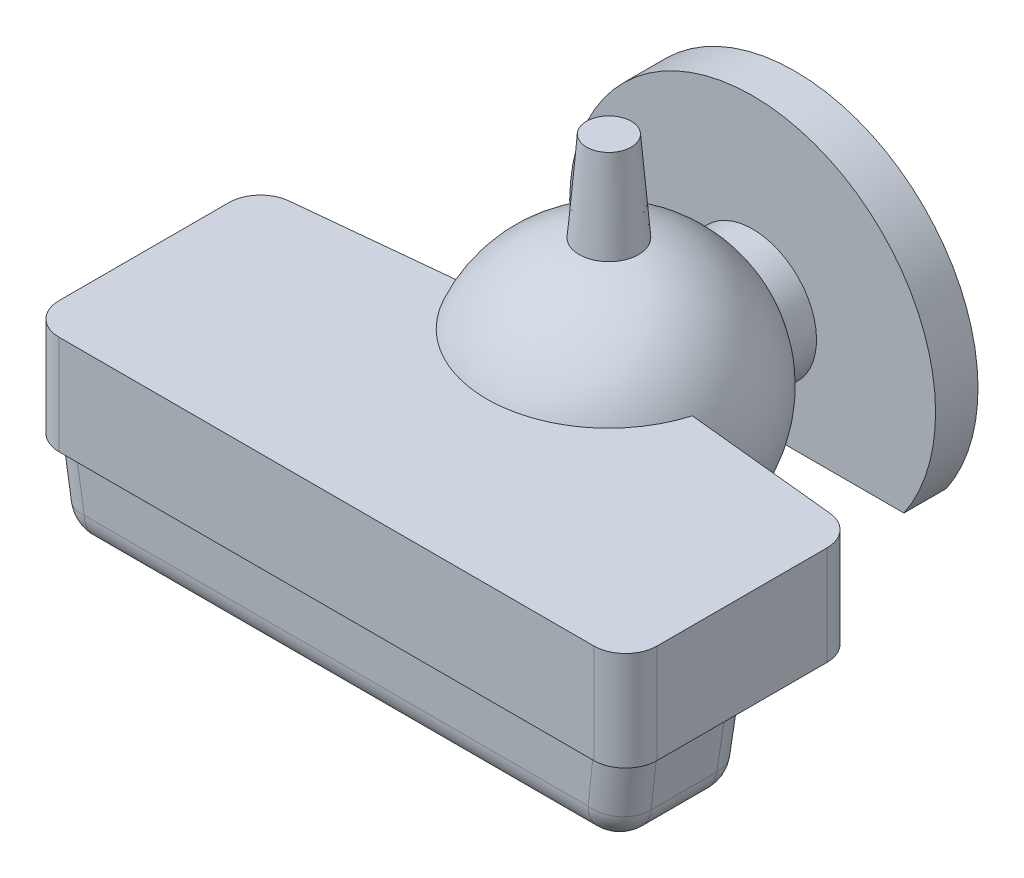
ISO-10303-21;
HEADER;
FILE_DESCRIPTION(('STEP AP214'),'2;1');
FILE_NAME('part.step','',(''),(''),'','','');
FILE_SCHEMA(('AUTOMOTIVE_DESIGN { 1 0 10303 214 1 1 1 1 }'));
ENDSEC;
DATA;
#1=APPLICATION_CONTEXT('core data for automotive mechanical design processes');
#2=APPLICATION_PROTOCOL_DEFINITION('international standard','automotive_design',2000,#1);
#3=PRODUCT_CONTEXT('',#1,'mechanical');
#4=PRODUCT('Part','Part','',(#3));
#5=PRODUCT_RELATED_PRODUCT_CATEGORY('part','',(#4));
#6=PRODUCT_DEFINITION_FORMATION('','',#4);
#7=PRODUCT_DEFINITION_CONTEXT('part definition',#1,'design');
#8=PRODUCT_DEFINITION('design','',#6,#7);
#9=PRODUCT_DEFINITION_SHAPE('','',#8);
#10=(LENGTH_UNIT() NAMED_UNIT(*) SI_UNIT(.MILLI.,.METRE.));
#11=(NAMED_UNIT(*) PLANE_ANGLE_UNIT() SI_UNIT($,.RADIAN.));
#12=(NAMED_UNIT(*) SI_UNIT($,.STERADIAN.) SOLID_ANGLE_UNIT());
#13=UNCERTAINTY_MEASURE_WITH_UNIT(LENGTH_MEASURE(1.E-05),#10,'distance_accuracy_value','');
#14=(GEOMETRIC_REPRESENTATION_CONTEXT(3) GLOBAL_UNCERTAINTY_ASSIGNED_CONTEXT((#13)) GLOBAL_UNIT_ASSIGNED_CONTEXT((#10,
#11,#12)) REPRESENTATION_CONTEXT('',''));
#15=CARTESIAN_POINT('',(0.,0.,0.));
#16=DIRECTION('',(0.,0.,1.));
#17=DIRECTION('',(1.,0.,0.));
#18=AXIS2_PLACEMENT_3D('',#15,#16,#17);
#19=CARTESIAN_POINT('',(15.5718563757614,46.1,26.46));
#20=DIRECTION('',(0.,-1.,0.));
#21=DIRECTION('',(0.,0.,-1.));
#22=AXIS2_PLACEMENT_3D('',#19,#20,#21);
#23=CONICAL_SURFACE('',#22,3.18,0.081260061509888);
#24=CARTESIAN_POINT('',(15.5718563757614,46.1,26.46));
#25=DIRECTION('',(0.,-1.,0.));
#26=DIRECTION('',(0.,0.,-1.));
#27=AXIS2_PLACEMENT_3D('',#24,#25,#26);
#28=CIRCLE('',#27,3.18);
#29=CARTESIAN_POINT('',(15.5718563757614,46.1,23.28));
#30=VERTEX_POINT('',#29);
#31=EDGE_CURVE('E11',#30,#30,#28,.T.);
#32=ORIENTED_EDGE('',*,*,#31,.T.);
#33=EDGE_LOOP('',(#32));
#34=FACE_BOUND('',#33,.T.);
#35=CARTESIAN_POINT('',(15.5718563757614,33.3793441016559,26.46));
#36=DIRECTION('',(0.,-1.,0.));
#37=DIRECTION('',(0.,0.,-1.));
#38=AXIS2_PLACEMENT_3D('',#35,#36,#37);
#39=CIRCLE('',#38,4.21596250687272);
#40=CARTESIAN_POINT('',(15.5718563757614,33.3793441016559,22.2440374931273));
#41=VERTEX_POINT('',#40);
#42=EDGE_CURVE('E204',#41,#41,#39,.T.);
#43=ORIENTED_EDGE('',*,*,#42,.F.);
#44=EDGE_LOOP('',(#43));
#45=FACE_BOUND('',#44,.T.);
#46=ADVANCED_FACE('F17',(#34,#45),#23,.T.);
#47=CARTESIAN_POINT('',(15.5718563757614,46.1,26.46));
#48=DIRECTION('',(0.,-1.,0.));
#49=DIRECTION('',(0.,0.,-1.));
#50=AXIS2_PLACEMENT_3D('',#47,#48,#49);
#51=PLANE('',#50);
#52=ORIENTED_EDGE('',*,*,#31,.F.);
#53=EDGE_LOOP('',(#52));
#54=FACE_BOUND('',#53,.T.);
#55=ADVANCED_FACE('F379',(#54),#51,.F.);
#56=CARTESIAN_POINT('',(-20.230588996658,0.780000000000002,51.375));
#57=DIRECTION('',(0.,0.,1.));
#58=DIRECTION('',(1.,0.,0.));
#59=AXIS2_PLACEMENT_3D('',#56,#57,#58);
#60=CYLINDRICAL_SURFACE('',#59,4.5);
#61=CARTESIAN_POINT('',(-20.230588996658,0.780000000000002,51.3870473088788));
#62=DIRECTION('',(0.,0.,1.));
#63=DIRECTION('',(1.,0.,0.));
#64=AXIS2_PLACEMENT_3D('',#61,#62,#63);
#65=CIRCLE('',#64,4.49999999999999);
#66=CARTESIAN_POINT('',(-24.692261915057,0.193932794617084,51.3870473088788));
#67=VERTEX_POINT('',#66);
#68=CARTESIAN_POINT('',(-20.230588996658,-3.72,51.3870473088788));
#69=VERTEX_POINT('',#68);
#70=EDGE_CURVE('E27',#67,#69,#65,.T.);
#71=ORIENTED_EDGE('',*,*,#70,.T.);
#72=DIRECTION('',(0.,0.,1.));
#73=VECTOR('',#72,1.);
#74=CARTESIAN_POINT('',(-20.230588996658,-3.72,51.375));
#75=LINE('',#74,#73);
#76=CARTESIAN_POINT('',(-20.230588996658,-3.72,60.7129526911211));
#77=VERTEX_POINT('',#76);
#78=EDGE_CURVE('E367',#69,#77,#75,.T.);
#79=ORIENTED_EDGE('',*,*,#78,.T.);
#80=CARTESIAN_POINT('',(-20.230588996658,0.780000000000002,60.7129526911211));
#81=DIRECTION('',(0.,0.,-1.));
#82=DIRECTION('',(0.,-1.,0.));
#83=AXIS2_PLACEMENT_3D('',#80,#81,#82);
#84=CIRCLE('',#83,4.5);
#85=CARTESIAN_POINT('',(-24.692261915057,0.193932794617085,60.7129526911211));
#86=VERTEX_POINT('',#85);
#87=EDGE_CURVE('E364',#77,#86,#84,.T.);
#88=ORIENTED_EDGE('',*,*,#87,.T.);
#89=DIRECTION('',(0.,0.,-1.));
#90=VECTOR('',#89,1.);
#91=CARTESIAN_POINT('',(-24.692261915057,0.193932794617085,51.375));
#92=LINE('',#91,#90);
#93=EDGE_CURVE('E361',#86,#67,#92,.T.);
#94=ORIENTED_EDGE('',*,*,#93,.T.);
#95=EDGE_LOOP('',(#71,#79,#88,#94));
#96=FACE_BOUND('',#95,.T.);
#97=ADVANCED_FACE('F386',(#96),#60,.T.);
#98=CARTESIAN_POINT('',(-5.07814362423863,0.780000000000003,60.7129526911211));
#99=DIRECTION('',(1.,0.,0.));
#100=DIRECTION('',(0.,1.,0.));
#101=AXIS2_PLACEMENT_3D('',#98,#99,#100);
#102=CYLINDRICAL_SURFACE('',#101,4.5);
#103=CARTESIAN_POINT('',(-20.230588996658,0.780000000000003,60.7129526911211));
#104=DIRECTION('',(1.,0.,0.));
#105=DIRECTION('',(0.,1.,0.));
#106=AXIS2_PLACEMENT_3D('',#103,#104,#105);
#107=CIRCLE('',#106,4.5);
#108=CARTESIAN_POINT('',(-20.230588996658,0.66563017674994,65.2114990722903));
#109=VERTEX_POINT('',#108);
#110=EDGE_CURVE('E359',#109,#77,#107,.T.);
#111=ORIENTED_EDGE('',*,*,#110,.T.);
#112=DIRECTION('',(1.,0.,0.));
#113=VECTOR('',#112,1.);
#114=CARTESIAN_POINT('',(-5.07814362423863,-3.72,60.7129526911211));
#115=LINE('',#114,#113);
#116=CARTESIAN_POINT('',(51.3743017481808,-3.72,60.7129526911211));
#117=VERTEX_POINT('',#116);
#118=EDGE_CURVE('E356',#77,#117,#115,.T.);
#119=ORIENTED_EDGE('',*,*,#118,.T.);
#120=CARTESIAN_POINT('',(51.3743017481808,0.780000000000003,60.7129526911211));
#121=DIRECTION('',(-1.,0.,0.));
#122=DIRECTION('',(0.,0.,1.));
#123=AXIS2_PLACEMENT_3D('',#120,#121,#122);
#124=CIRCLE('',#123,4.5);
#125=CARTESIAN_POINT('',(51.3743017481808,0.66563017674994,65.2114990722903));
#126=VERTEX_POINT('',#125);
#127=EDGE_CURVE('E353',#117,#126,#124,.T.);
#128=ORIENTED_EDGE('',*,*,#127,.T.);
#129=DIRECTION('',(-1.,0.,0.));
#130=VECTOR('',#129,1.);
#131=CARTESIAN_POINT('',(-5.07814362423863,0.66563017674994,65.2114990722903));
#132=LINE('',#131,#130);
#133=EDGE_CURVE('E350',#126,#109,#132,.T.);
#134=ORIENTED_EDGE('',*,*,#133,.T.);
#135=EDGE_LOOP('',(#111,#119,#128,#134));
#136=FACE_BOUND('',#135,.T.);
#137=ADVANCED_FACE('F400',(#136),#102,.T.);
#138=CARTESIAN_POINT('',(-20.230588996658,0.780000000000002,60.7129526911211));
#139=DIRECTION('',(0.,0.,1.));
#140=DIRECTION('',(1.,0.,0.));
#141=AXIS2_PLACEMENT_3D('',#138,#139,#140);
#142=SPHERICAL_SURFACE('',#141,4.5);
#143=ORIENTED_EDGE('',*,*,#110,.F.);
#144=CARTESIAN_POINT('',(-20.230588996658,0.780000000000004,60.7129526911211));
#145=DIRECTION('',(0.13019579995124,-0.991168025435241,-0.0251991870873368));
#146=DIRECTION('',(0.,0.0254155162777918,-0.999676973593137));
#147=AXIS2_PLACEMENT_3D('',#144,#145,#146);
#148=CIRCLE('',#147,4.5);
#149=EDGE_CURVE('E348',#109,#86,#148,.T.);
#150=ORIENTED_EDGE('',*,*,#149,.T.);
#151=ORIENTED_EDGE('',*,*,#87,.F.);
#152=EDGE_LOOP('',(#143,#150,#151));
#153=FACE_BOUND('',#152,.T.);
#154=ADVANCED_FACE('F404',(#153),#142,.T.);
#155=CARTESIAN_POINT('',(51.3743017481808,0.780000000000003,60.725));
#156=DIRECTION('',(0.,0.,-1.));
#157=DIRECTION('',(-1.,0.,0.));
#158=AXIS2_PLACEMENT_3D('',#155,#156,#157);
#159=CYLINDRICAL_SURFACE('',#158,4.5);
#160=CARTESIAN_POINT('',(51.3743017481808,0.780000000000003,60.7129526911211));
#161=DIRECTION('',(0.,0.,-1.));
#162=DIRECTION('',(0.,-1.,0.));
#163=AXIS2_PLACEMENT_3D('',#160,#161,#162);
#164=CIRCLE('',#163,4.5);
#165=CARTESIAN_POINT('',(55.8359746665797,0.193932794617094,60.7129526911211));
#166=VERTEX_POINT('',#165);
#167=EDGE_CURVE('E346',#166,#117,#164,.T.);
#168=ORIENTED_EDGE('',*,*,#167,.T.);
#169=DIRECTION('',(0.,0.,-1.));
#170=VECTOR('',#169,1.);
#171=CARTESIAN_POINT('',(51.3743017481808,-3.72,60.725));
#172=LINE('',#171,#170);
#173=CARTESIAN_POINT('',(51.3743017481808,-3.72,51.3870473088789));
#174=VERTEX_POINT('',#173);
#175=EDGE_CURVE('E343',#117,#174,#172,.T.);
#176=ORIENTED_EDGE('',*,*,#175,.T.);
#177=CARTESIAN_POINT('',(51.3743017481808,0.780000000000003,51.3870473088789));
#178=DIRECTION('',(0.,0.,1.));
#179=DIRECTION('',(1.,0.,0.));
#180=AXIS2_PLACEMENT_3D('',#177,#178,#179);
#181=CIRCLE('',#180,4.5);
#182=CARTESIAN_POINT('',(55.8359746665797,0.193932794617094,51.3870473088789));
#183=VERTEX_POINT('',#182);
#184=EDGE_CURVE('E340',#174,#183,#181,.T.);
#185=ORIENTED_EDGE('',*,*,#184,.T.);
#186=DIRECTION('',(0.,0.,1.));
#187=VECTOR('',#186,1.);
#188=CARTESIAN_POINT('',(55.8359746665797,0.193932794617094,60.725));
#189=LINE('',#188,#187);
#190=EDGE_CURVE('E337',#183,#166,#189,.T.);
#191=ORIENTED_EDGE('',*,*,#190,.T.);
#192=EDGE_LOOP('',(#168,#176,#185,#191));
#193=FACE_BOUND('',#192,.T.);
#194=ADVANCED_FACE('F406',(#193),#159,.T.);
#195=CARTESIAN_POINT('',(51.3743017481808,0.780000000000003,60.7129526911211));
#196=DIRECTION('',(0.,0.,1.));
#197=DIRECTION('',(1.,0.,0.));
#198=AXIS2_PLACEMENT_3D('',#195,#196,#197);
#199=SPHERICAL_SURFACE('',#198,4.5);
#200=ORIENTED_EDGE('',*,*,#167,.F.);
#201=CARTESIAN_POINT('',(51.3743017481808,0.780000000000003,60.7129526911211));
#202=DIRECTION('',(-0.130195799951238,-0.991168025435241,-0.0251991870873369));
#203=DIRECTION('',(-0.991482870755324,0.130237156751757,0.));
#204=AXIS2_PLACEMENT_3D('',#201,#202,#203);
#205=CIRCLE('',#204,4.5);
#206=EDGE_CURVE('E335',#166,#126,#205,.T.);
#207=ORIENTED_EDGE('',*,*,#206,.T.);
#208=ORIENTED_EDGE('',*,*,#127,.F.);
#209=EDGE_LOOP('',(#200,#207,#208));
#210=FACE_BOUND('',#209,.T.);
#211=ADVANCED_FACE('F397',(#210),#199,.T.);
#212=CARTESIAN_POINT('',(36.2218563757614,0.780000000000003,51.3870473088788));
#213=DIRECTION('',(-1.,0.,0.));
#214=DIRECTION('',(0.,0.,1.));
#215=AXIS2_PLACEMENT_3D('',#212,#213,#214);
#216=CYLINDRICAL_SURFACE('',#215,4.5);
#217=CARTESIAN_POINT('',(51.3743017481808,0.780000000000003,51.3870473088788));
#218=DIRECTION('',(-1.,0.,0.));
#219=DIRECTION('',(0.,0.,1.));
#220=AXIS2_PLACEMENT_3D('',#217,#218,#219);
#221=CIRCLE('',#220,4.49999999999999);
#222=CARTESIAN_POINT('',(51.3743017481808,0.665630176749943,46.8885009277097));
#223=VERTEX_POINT('',#222);
#224=EDGE_CURVE('E333',#223,#174,#221,.T.);
#225=ORIENTED_EDGE('',*,*,#224,.T.);
#226=DIRECTION('',(-1.,0.,0.));
#227=VECTOR('',#226,1.);
#228=CARTESIAN_POINT('',(36.2218563757614,-3.72,51.3870473088788));
#229=LINE('',#228,#227);
#230=EDGE_CURVE('E36',#174,#69,#229,.T.);
#231=ORIENTED_EDGE('',*,*,#230,.T.);
#232=CARTESIAN_POINT('',(-20.230588996658,0.780000000000003,51.3870473088788));
#233=DIRECTION('',(1.,0.,0.));
#234=DIRECTION('',(0.,0.,1.));
#235=AXIS2_PLACEMENT_3D('',#232,#233,#234);
#236=CIRCLE('',#235,4.5);
#237=CARTESIAN_POINT('',(-20.230588996658,0.665630176749943,46.8885009277097));
#238=VERTEX_POINT('',#237);
#239=EDGE_CURVE('E330',#69,#238,#236,.T.);
#240=ORIENTED_EDGE('',*,*,#239,.T.);
#241=DIRECTION('',(1.,0.,0.));
#242=VECTOR('',#241,1.);
#243=CARTESIAN_POINT('',(36.2218563757614,0.665630176749943,46.8885009277097));
#244=LINE('',#243,#242);
#245=EDGE_CURVE('E327',#238,#223,#244,.T.);
#246=ORIENTED_EDGE('',*,*,#245,.T.);
#247=EDGE_LOOP('',(#225,#231,#240,#246));
#248=FACE_BOUND('',#247,.T.);
#249=ADVANCED_FACE('F393',(#248),#216,.T.);
#250=CARTESIAN_POINT('',(51.3743017481808,0.780000000000003,51.3870473088789));
#251=DIRECTION('',(0.,0.,1.));
#252=DIRECTION('',(1.,0.,0.));
#253=AXIS2_PLACEMENT_3D('',#250,#251,#252);
#254=SPHERICAL_SURFACE('',#253,4.5);
#255=ORIENTED_EDGE('',*,*,#224,.F.);
#256=CARTESIAN_POINT('',(51.3743017481808,0.780000000000002,51.3870473088789));
#257=DIRECTION('',(-0.130195799951238,-0.991168025435241,0.0251991870873361));
#258=DIRECTION('',(-0.991482870755324,0.130237156751757,0.));
#259=AXIS2_PLACEMENT_3D('',#256,#257,#258);
#260=CIRCLE('',#259,4.50000000000001);
#261=EDGE_CURVE('E325',#223,#183,#260,.T.);
#262=ORIENTED_EDGE('',*,*,#261,.T.);
#263=ORIENTED_EDGE('',*,*,#184,.F.);
#264=EDGE_LOOP('',(#255,#262,#263));
#265=FACE_BOUND('',#264,.T.);
#266=ADVANCED_FACE('F396',(#265),#254,.T.);
#267=CARTESIAN_POINT('',(-20.230588996658,0.780000000000003,51.3870473088788));
#268=DIRECTION('',(0.,0.,1.));
#269=DIRECTION('',(1.,0.,0.));
#270=AXIS2_PLACEMENT_3D('',#267,#268,#269);
#271=SPHERICAL_SURFACE('',#270,4.5);
#272=ORIENTED_EDGE('',*,*,#70,.F.);
#273=CARTESIAN_POINT('',(-20.230588996658,0.780000000000003,51.3870473088788));
#274=DIRECTION('',(0.13019579995124,-0.991168025435241,0.0251991870873362));
#275=DIRECTION('',(0.,-0.0254155162777911,-0.999676973593137));
#276=AXIS2_PLACEMENT_3D('',#273,#274,#275);
#277=CIRCLE('',#276,4.5);
#278=EDGE_CURVE('E323',#67,#238,#277,.T.);
#279=ORIENTED_EDGE('',*,*,#278,.T.);
#280=ORIENTED_EDGE('',*,*,#239,.F.);
#281=EDGE_LOOP('',(#272,#279,#280));
#282=FACE_BOUND('',#281,.T.);
#283=ADVANCED_FACE('F414',(#282),#271,.T.);
#284=CARTESIAN_POINT('',(51.7248289878145,3.44852995334088,60.7807966729857));
#285=DIRECTION('',(-0.130195799951238,-0.991168025435241,-0.0251991870873369));
#286=DIRECTION('',(-0.991482870755324,0.130237156751757,0.));
#287=AXIS2_PLACEMENT_3D('',#284,#285,#286);
#288=CYLINDRICAL_SURFACE('',#287,4.5);
#289=ORIENTED_EDGE('',*,*,#206,.F.);
#290=DIRECTION('',(0.130195799951238,0.991168025435241,0.0251991870873369));
#291=VECTOR('',#290,1.);
#292=CARTESIAN_POINT('',(56.1865019062135,2.86246274795797,60.7807966729857));
#293=LINE('',#292,#291);
#294=CARTESIAN_POINT('',(56.8718563757614,8.08,60.9134459251563));
#295=VERTEX_POINT('',#294);
#296=EDGE_CURVE('E320',#166,#295,#293,.T.);
#297=ORIENTED_EDGE('',*,*,#296,.T.);
#298=CARTESIAN_POINT('',(52.3332000532655,8.08,60.8985459114601));
#299=DIRECTION('',(0.,-1.,0.));
#300=DIRECTION('',(0.981779850590282,0.,0.190021906565858));
#301=AXIS2_PLACEMENT_3D('',#298,#299,#300);
#302=ELLIPSE('',#301,4.54009803032535,4.5);
#303=CARTESIAN_POINT('',(52.3482232080145,8.08,65.4));
#304=VERTEX_POINT('',#303);
#305=EDGE_CURVE('E317',#295,#304,#302,.T.);
#306=ORIENTED_EDGE('',*,*,#305,.T.);
#307=DIRECTION('',(-0.130195799951238,-0.991168025435241,-0.0251991870873369));
#308=VECTOR('',#307,1.);
#309=CARTESIAN_POINT('',(51.7248289878145,3.33416013009082,65.2793430541549));
#310=LINE('',#309,#308);
#311=EDGE_CURVE('E311',#304,#126,#310,.T.);
#312=ORIENTED_EDGE('',*,*,#311,.T.);
#313=EDGE_LOOP('',(#289,#297,#306,#312));
#314=FACE_BOUND('',#313,.T.);
#315=ADVANCED_FACE('F410',(#314),#288,.T.);
#316=CARTESIAN_POINT('',(56.8718563757614,8.08,65.4));
#317=DIRECTION('',(-0.991482870755324,0.130237156751757,0.));
#318=DIRECTION('',(-0.130237156751757,-0.991482870755324,0.));
#319=AXIS2_PLACEMENT_3D('',#316,#317,#318);
#320=PLANE('',#319);
#321=ORIENTED_EDGE('',*,*,#190,.F.);
#322=DIRECTION('',(-0.130195799951238,-0.991168025435241,0.0251991870873361));
#323=VECTOR('',#322,1.);
#324=CARTESIAN_POINT('',(56.8559002446327,7.95852751785897,51.189642358288));
#325=LINE('',#324,#323);
#326=CARTESIAN_POINT('',(56.8718563757614,8.08,51.1865540748437));
#327=VERTEX_POINT('',#326);
#328=EDGE_CURVE('E301',#327,#183,#325,.T.);
#329=ORIENTED_EDGE('',*,*,#328,.F.);
#330=DIRECTION('',(0.,0.,-1.));
#331=VECTOR('',#330,1.);
#332=CARTESIAN_POINT('',(56.8718563757614,8.08,57.4360883722715));
#333=LINE('',#332,#331);
#334=EDGE_CURVE('E294',#295,#327,#333,.T.);
#335=ORIENTED_EDGE('',*,*,#334,.F.);
#336=ORIENTED_EDGE('',*,*,#296,.F.);
#337=EDGE_LOOP('',(#321,#329,#335,#336));
#338=FACE_BOUND('',#337,.T.);
#339=ADVANCED_FACE('F413',(#338),#320,.F.);
#340=CARTESIAN_POINT('',(52.3942273262337,8.54459472324188,51.189642358288));
#341=DIRECTION('',(-0.130195799951238,-0.991168025435241,0.0251991870873361));
#342=DIRECTION('',(-0.991482870755324,0.130237156751757,0.));
#343=AXIS2_PLACEMENT_3D('',#340,#341,#342);
#344=CYLINDRICAL_SURFACE('',#343,4.5);
#345=ORIENTED_EDGE('',*,*,#261,.F.);
#346=DIRECTION('',(0.130195799951238,0.991168025435241,-0.0251991870873361));
#347=VECTOR('',#346,1.);
#348=CARTESIAN_POINT('',(52.3942273262337,8.43022489999182,46.6910959771189));
#349=LINE('',#348,#347);
#350=CARTESIAN_POINT('',(52.3482232080145,8.08,46.7));
#351=VERTEX_POINT('',#350);
#352=EDGE_CURVE('E308',#223,#351,#349,.T.);
#353=ORIENTED_EDGE('',*,*,#352,.T.);
#354=CARTESIAN_POINT('',(52.3332000532655,8.08,51.2014540885399));
#355=DIRECTION('',(0.,-1.,0.));
#356=DIRECTION('',(0.981779850590281,0.,-0.190021906565864));
#357=AXIS2_PLACEMENT_3D('',#354,#355,#356);
#358=ELLIPSE('',#357,4.54009803032535,4.5);
#359=EDGE_CURVE('E305',#351,#327,#358,.T.);
#360=ORIENTED_EDGE('',*,*,#359,.T.);
#361=ORIENTED_EDGE('',*,*,#328,.T.);
#362=EDGE_LOOP('',(#345,#353,#360,#361));
#363=FACE_BOUND('',#362,.T.);
#364=ADVANCED_FACE('F416',(#363),#344,.T.);
#365=CARTESIAN_POINT('',(56.8718563757614,8.08,46.7));
#366=DIRECTION('',(0.,0.0254155162777911,0.999676973593137));
#367=DIRECTION('',(0.,-0.999676973593137,0.0254155162777911));
#368=AXIS2_PLACEMENT_3D('',#365,#366,#367);
#369=PLANE('',#368);
#370=ORIENTED_EDGE('',*,*,#245,.F.);
#371=DIRECTION('',(0.13019579995124,-0.991168025435241,0.0251991870873362));
#372=VECTOR('',#371,1.);
#373=CARTESIAN_POINT('',(-20.5811162362918,3.33416013009074,46.8206569458451));
#374=LINE('',#373,#372);
#375=CARTESIAN_POINT('',(-21.2045104564917,8.08,46.7));
#376=VERTEX_POINT('',#375);
#377=EDGE_CURVE('E288',#376,#238,#374,.T.);
#378=ORIENTED_EDGE('',*,*,#377,.F.);
#379=DIRECTION('',(-1.,0.,0.));
#380=VECTOR('',#379,1.);
#381=CARTESIAN_POINT('',(36.2218563757614,8.08,46.7));
#382=LINE('',#381,#380);
#383=EDGE_CURVE('E291',#351,#376,#382,.T.);
#384=ORIENTED_EDGE('',*,*,#383,.F.);
#385=ORIENTED_EDGE('',*,*,#352,.F.);
#386=EDGE_LOOP('',(#370,#378,#384,#385));
#387=FACE_BOUND('',#386,.T.);
#388=ADVANCED_FACE('F419',(#387),#369,.F.);
#389=CARTESIAN_POINT('',(15.5718563757614,-3.72,56.05));
#390=DIRECTION('',(0.,1.,0.));
#391=DIRECTION('',(0.,0.,1.));
#392=AXIS2_PLACEMENT_3D('',#389,#390,#391);
#393=PLANE('',#392);
#394=ORIENTED_EDGE('',*,*,#78,.F.);
#395=ORIENTED_EDGE('',*,*,#230,.F.);
#396=ORIENTED_EDGE('',*,*,#175,.F.);
#397=ORIENTED_EDGE('',*,*,#118,.F.);
#398=EDGE_LOOP('',(#394,#395,#396,#397));
#399=FACE_BOUND('',#398,.T.);
#400=ADVANCED_FACE('F425',(#399),#393,.F.);
#401=CARTESIAN_POINT('',(-20.5811162362918,3.4485299533408,51.3192033270143));
#402=DIRECTION('',(0.13019579995124,-0.991168025435241,0.0251991870873362));
#403=DIRECTION('',(0.,-0.0254155162777911,-0.999676973593137));
#404=AXIS2_PLACEMENT_3D('',#401,#402,#403);
#405=CYLINDRICAL_SURFACE('',#404,4.5);
#406=ORIENTED_EDGE('',*,*,#278,.F.);
#407=DIRECTION('',(-0.13019579995124,0.991168025435241,-0.0251991870873362));
#408=VECTOR('',#407,1.);
#409=CARTESIAN_POINT('',(-25.0427891546907,2.86246274795788,51.3192033270143));
#410=LINE('',#409,#408);
#411=CARTESIAN_POINT('',(-25.7281436242386,8.08,51.1865540748437));
#412=VERTEX_POINT('',#411);
#413=EDGE_CURVE('E298',#67,#412,#410,.T.);
#414=ORIENTED_EDGE('',*,*,#413,.T.);
#415=CARTESIAN_POINT('',(-21.1894873017428,8.08,51.2014540885399));
#416=DIRECTION('',(0.,-1.,0.));
#417=DIRECTION('',(-0.981779850590283,0.,-0.190021906565852));
#418=AXIS2_PLACEMENT_3D('',#415,#416,#417);
#419=ELLIPSE('',#418,4.54009803032535,4.5);
#420=EDGE_CURVE('E295',#412,#376,#419,.T.);
#421=ORIENTED_EDGE('',*,*,#420,.T.);
#422=ORIENTED_EDGE('',*,*,#377,.T.);
#423=EDGE_LOOP('',(#406,#414,#421,#422));
#424=FACE_BOUND('',#423,.T.);
#425=ADVANCED_FACE('F421',(#424),#405,.T.);
#426=CARTESIAN_POINT('',(-25.7281436242386,8.08,46.7));
#427=DIRECTION('',(0.991482870755324,0.13023715675176,0.));
#428=DIRECTION('',(-0.13023715675176,0.991482870755324,0.));
#429=AXIS2_PLACEMENT_3D('',#426,#427,#428);
#430=PLANE('',#429);
#431=ORIENTED_EDGE('',*,*,#93,.F.);
#432=DIRECTION('',(0.13019579995124,-0.991168025435241,-0.0251991870873368));
#433=VECTOR('',#432,1.);
#434=CARTESIAN_POINT('',(-25.7121874931099,7.95852751785897,60.910357641712));
#435=LINE('',#434,#433);
#436=CARTESIAN_POINT('',(-25.7281436242386,8.08,60.9134459251563));
#437=VERTEX_POINT('',#436);
#438=EDGE_CURVE('E289',#437,#86,#435,.T.);
#439=ORIENTED_EDGE('',*,*,#438,.F.);
#440=DIRECTION('',(0.,0.,1.));
#441=VECTOR('',#440,1.);
#442=CARTESIAN_POINT('',(-25.7281436242386,8.08,48.0860883722715));
#443=LINE('',#442,#441);
#444=EDGE_CURVE('E284',#412,#437,#443,.T.);
#445=ORIENTED_EDGE('',*,*,#444,.F.);
#446=ORIENTED_EDGE('',*,*,#413,.F.);
#447=EDGE_LOOP('',(#431,#439,#445,#446));
#448=FACE_BOUND('',#447,.T.);
#449=ADVANCED_FACE('F424',(#448),#430,.F.);
#450=CARTESIAN_POINT('',(-21.250514574711,8.54459472324189,60.910357641712));
#451=DIRECTION('',(0.13019579995124,-0.991168025435241,-0.0251991870873368));
#452=DIRECTION('',(0.,0.0254155162777918,-0.999676973593137));
#453=AXIS2_PLACEMENT_3D('',#450,#451,#452);
#454=CYLINDRICAL_SURFACE('',#453,4.5);
#455=ORIENTED_EDGE('',*,*,#149,.F.);
#456=DIRECTION('',(-0.13019579995124,0.991168025435241,0.0251991870873368));
#457=VECTOR('',#456,1.);
#458=CARTESIAN_POINT('',(-21.250514574711,8.43022489999182,65.4089040228811));
#459=LINE('',#458,#457);
#460=CARTESIAN_POINT('',(-21.2045104564917,8.08,65.4));
#461=VERTEX_POINT('',#460);
#462=EDGE_CURVE('E285',#109,#461,#459,.T.);
#463=ORIENTED_EDGE('',*,*,#462,.T.);
#464=CARTESIAN_POINT('',(-21.1894873017428,8.08,60.8985459114601));
#465=DIRECTION('',(0.,1.,0.));
#466=DIRECTION('',(-0.98177985059028,0.,0.190021906565866));
#467=AXIS2_PLACEMENT_3D('',#464,#465,#466);
#468=ELLIPSE('',#467,4.54009803032535,4.5);
#469=EDGE_CURVE('E282',#437,#461,#468,.T.);
#470=ORIENTED_EDGE('',*,*,#469,.F.);
#471=ORIENTED_EDGE('',*,*,#438,.T.);
#472=EDGE_LOOP('',(#455,#463,#470,#471));
#473=FACE_BOUND('',#472,.T.);
#474=ADVANCED_FACE('F427',(#473),#454,.T.);
#475=CARTESIAN_POINT('',(-25.7281436242386,8.08,65.4));
#476=DIRECTION('',(0.,0.0254155162777918,-0.999676973593137));
#477=DIRECTION('',(0.,0.999676973593137,0.0254155162777918));
#478=AXIS2_PLACEMENT_3D('',#475,#476,#477);
#479=PLANE('',#478);
#480=ORIENTED_EDGE('',*,*,#133,.F.);
#481=ORIENTED_EDGE('',*,*,#311,.F.);
#482=DIRECTION('',(1.,0.,0.));
#483=VECTOR('',#482,1.);
#484=CARTESIAN_POINT('',(-5.07814362423863,8.08,65.4));
#485=LINE('',#484,#483);
#486=EDGE_CURVE('E264',#461,#304,#485,.T.);
#487=ORIENTED_EDGE('',*,*,#486,.F.);
#488=ORIENTED_EDGE('',*,*,#462,.F.);
#489=EDGE_LOOP('',(#480,#481,#487,#488));
#490=FACE_BOUND('',#489,.T.);
#491=ADVANCED_FACE('F430',(#490),#479,.F.);
#492=CARTESIAN_POINT('',(15.5718563757614,8.08,49.472176744543));
#493=DIRECTION('',(0.,1.,0.));
#494=DIRECTION('',(0.,0.,1.));
#495=AXIS2_PLACEMENT_3D('',#492,#493,#494);
#496=PLANE('',#495);
#497=ORIENTED_EDGE('',*,*,#334,.T.);
#498=ORIENTED_EDGE('',*,*,#359,.F.);
#499=ORIENTED_EDGE('',*,*,#383,.T.);
#500=ORIENTED_EDGE('',*,*,#420,.F.);
#501=ORIENTED_EDGE('',*,*,#444,.T.);
#502=ORIENTED_EDGE('',*,*,#469,.T.);
#503=ORIENTED_EDGE('',*,*,#486,.T.);
#504=ORIENTED_EDGE('',*,*,#305,.F.);
#505=EDGE_LOOP('',(#497,#498,#499,#500,#501,#502,#503,#504));
#506=FACE_BOUND('',#505,.T.);
#507=CARTESIAN_POINT('',(53.5718563757614,8.08,62.1));
#508=DIRECTION('',(0.,1.,0.));
#509=DIRECTION('',(1.,0.,0.));
#510=AXIS2_PLACEMENT_3D('',#507,#508,#509);
#511=CIRCLE('',#510,4.5);
#512=CARTESIAN_POINT('',(53.5718563757614,8.08,66.6));
#513=VERTEX_POINT('',#512);
#514=CARTESIAN_POINT('',(58.0718563757614,8.08,62.1));
#515=VERTEX_POINT('',#514);
#516=EDGE_CURVE('E212',#513,#515,#511,.T.);
#517=ORIENTED_EDGE('',*,*,#516,.F.);
#518=DIRECTION('',(1.,0.,0.));
#519=VECTOR('',#518,1.);
#520=CARTESIAN_POINT('',(15.5718563757614,8.08,66.6));
#521=LINE('',#520,#519);
#522=CARTESIAN_POINT('',(-22.4281436242386,8.08,66.6));
#523=VERTEX_POINT('',#522);
#524=EDGE_CURVE('E217',#523,#513,#521,.T.);
#525=ORIENTED_EDGE('',*,*,#524,.F.);
#526=CARTESIAN_POINT('',(-22.4281436242386,8.08,62.1));
#527=DIRECTION('',(0.,1.,0.));
#528=DIRECTION('',(1.,0.,0.));
#529=AXIS2_PLACEMENT_3D('',#526,#527,#528);
#530=CIRCLE('',#529,4.5);
#531=CARTESIAN_POINT('',(-26.9281436242386,8.08,62.1));
#532=VERTEX_POINT('',#531);
#533=EDGE_CURVE('E216',#532,#523,#530,.T.);
#534=ORIENTED_EDGE('',*,*,#533,.F.);
#535=DIRECTION('',(0.,0.,1.));
#536=VECTOR('',#535,1.);
#537=CARTESIAN_POINT('',(-26.9281436242386,8.08,33.9));
#538=LINE('',#537,#536);
#539=CARTESIAN_POINT('',(-26.9281436242386,8.08,37.9665588315967));
#540=VERTEX_POINT('',#539);
#541=EDGE_CURVE('E241',#540,#532,#538,.T.);
#542=ORIENTED_EDGE('',*,*,#541,.F.);
#543=CARTESIAN_POINT('',(-22.4281436242386,8.08,37.9665588315967));
#544=DIRECTION('',(0.,1.,0.));
#545=DIRECTION('',(1.,0.,0.));
#546=AXIS2_PLACEMENT_3D('',#543,#544,#545);
#547=CIRCLE('',#546,4.5);
#548=CARTESIAN_POINT('',(-22.8823527687787,8.08,33.4895403981952));
#549=VERTEX_POINT('',#548);
#550=EDGE_CURVE('E227',#549,#540,#547,.T.);
#551=ORIENTED_EDGE('',*,*,#550,.F.);
#552=DIRECTION('',(-0.994892985200317,0.,0.100935365453352));
#553=VECTOR('',#552,1.);
#554=CARTESIAN_POINT('',(-7.21467687783633,8.08,31.9));
#555=LINE('',#554,#553);
#556=CARTESIAN_POINT('',(-1.09797870777889,8.08,31.2794396238121));
#557=VERTEX_POINT('',#556);
#558=EDGE_CURVE('E238',#557,#549,#555,.T.);
#559=ORIENTED_EDGE('',*,*,#558,.F.);
#560=CARTESIAN_POINT('',(15.5718563757614,8.08,26.46));
#561=DIRECTION('',(0.,-1.,0.));
#562=DIRECTION('',(-1.,0.,0.));
#563=AXIS2_PLACEMENT_3D('',#560,#561,#562);
#564=CIRCLE('',#563,17.3525329563151);
#565=CARTESIAN_POINT('',(32.2416914593016,8.08,31.2794396238121));
#566=VERTEX_POINT('',#565);
#567=EDGE_CURVE('E195',#566,#557,#564,.T.);
#568=ORIENTED_EDGE('',*,*,#567,.F.);
#569=DIRECTION('',(-0.994892985200317,0.,-0.100935365453353));
#570=VECTOR('',#569,1.);
#571=CARTESIAN_POINT('',(38.3583896293591,8.08,31.9));
#572=LINE('',#571,#570);
#573=CARTESIAN_POINT('',(54.0260655203015,8.08,33.4895403981952));
#574=VERTEX_POINT('',#573);
#575=EDGE_CURVE('E207',#574,#566,#572,.T.);
#576=ORIENTED_EDGE('',*,*,#575,.F.);
#577=CARTESIAN_POINT('',(53.5718563757614,8.08,37.9665588315967));
#578=DIRECTION('',(0.,1.,0.));
#579=DIRECTION('',(1.,0.,0.));
#580=AXIS2_PLACEMENT_3D('',#577,#578,#579);
#581=CIRCLE('',#580,4.5);
#582=CARTESIAN_POINT('',(58.0718563757614,8.08,37.9665588315967));
#583=VERTEX_POINT('',#582);
#584=EDGE_CURVE('E257',#583,#574,#581,.T.);
#585=ORIENTED_EDGE('',*,*,#584,.F.);
#586=DIRECTION('',(0.,0.,-1.));
#587=VECTOR('',#586,1.);
#588=CARTESIAN_POINT('',(58.0718563757614,8.08,66.6));
#589=LINE('',#588,#587);
#590=EDGE_CURVE('E244',#515,#583,#589,.T.);
#591=ORIENTED_EDGE('',*,*,#590,.F.);
#592=EDGE_LOOP('',(#517,#525,#534,#542,#551,#559,#568,#576,#585,#591));
#593=FACE_BOUND('',#592,.T.);
#594=ADVANCED_FACE('F436',(#506,#593),#496,.F.);
#595=CARTESIAN_POINT('',(53.5718563757614,15.13,37.9665588315967));
#596=DIRECTION('',(0.,1.,0.));
#597=DIRECTION('',(1.,0.,0.));
#598=AXIS2_PLACEMENT_3D('',#595,#596,#597);
#599=CYLINDRICAL_SURFACE('',#598,4.5);
#600=CARTESIAN_POINT('',(53.5718563757614,22.18,37.9665588315967));
#601=DIRECTION('',(0.,-1.,0.));
#602=DIRECTION('',(-1.,0.,0.));
#603=AXIS2_PLACEMENT_3D('',#600,#601,#602);
#604=CIRCLE('',#603,4.5);
#605=CARTESIAN_POINT('',(54.0260655203015,22.18,33.4895403981952));
#606=VERTEX_POINT('',#605);
#607=CARTESIAN_POINT('',(58.0718563757614,22.18,37.9665588315967));
#608=VERTEX_POINT('',#607);
#609=EDGE_CURVE('E261',#606,#608,#604,.T.);
#610=ORIENTED_EDGE('',*,*,#609,.T.);
#611=DIRECTION('',(0.,-1.,0.));
#612=VECTOR('',#611,1.);
#613=CARTESIAN_POINT('',(58.0718563757614,15.13,37.9665588315967));
#614=LINE('',#613,#612);
#615=EDGE_CURVE('E258',#608,#583,#614,.T.);
#616=ORIENTED_EDGE('',*,*,#615,.T.);
#617=ORIENTED_EDGE('',*,*,#584,.T.);
#618=DIRECTION('',(0.,1.,0.));
#619=VECTOR('',#618,1.);
#620=CARTESIAN_POINT('',(54.0260655203015,15.13,33.4895403981952));
#621=LINE('',#620,#619);
#622=EDGE_CURVE('E255',#574,#606,#621,.T.);
#623=ORIENTED_EDGE('',*,*,#622,.T.);
#624=EDGE_LOOP('',(#610,#616,#617,#623));
#625=FACE_BOUND('',#624,.T.);
#626=ADVANCED_FACE('F432',(#625),#599,.T.);
#627=CARTESIAN_POINT('',(58.0718563757614,15.13,66.6));
#628=DIRECTION('',(1.,0.,0.));
#629=DIRECTION('',(0.,0.,-1.));
#630=AXIS2_PLACEMENT_3D('',#627,#628,#629);
#631=PLANE('',#630);
#632=ORIENTED_EDGE('',*,*,#615,.F.);
#633=DIRECTION('',(0.,0.,1.));
#634=VECTOR('',#633,1.);
#635=CARTESIAN_POINT('',(58.0718563757614,22.18,66.6));
#636=LINE('',#635,#634);
#637=CARTESIAN_POINT('',(58.0718563757614,22.18,62.1));
#638=VERTEX_POINT('',#637);
#639=EDGE_CURVE('E252',#608,#638,#636,.T.);
#640=ORIENTED_EDGE('',*,*,#639,.T.);
#641=DIRECTION('',(0.,1.,0.));
#642=VECTOR('',#641,1.);
#643=CARTESIAN_POINT('',(58.0718563757614,15.13,62.1));
#644=LINE('',#643,#642);
#645=EDGE_CURVE('E199',#515,#638,#644,.T.);
#646=ORIENTED_EDGE('',*,*,#645,.F.);
#647=ORIENTED_EDGE('',*,*,#590,.T.);
#648=EDGE_LOOP('',(#632,#640,#646,#647));
#649=FACE_BOUND('',#648,.T.);
#650=ADVANCED_FACE('F435',(#649),#631,.T.);
#651=CARTESIAN_POINT('',(15.5718563757614,22.18,49.472176744543));
#652=DIRECTION('',(0.,1.,0.));
#653=DIRECTION('',(0.,0.,1.));
#654=AXIS2_PLACEMENT_3D('',#651,#652,#653);
#655=PLANE('',#654);
#656=ORIENTED_EDGE('',*,*,#609,.F.);
#657=DIRECTION('',(0.994892985200317,0.,0.100935365453352));
#658=VECTOR('',#657,1.);
#659=CARTESIAN_POINT('',(58.0718563757614,22.18,33.9));
#660=LINE('',#659,#658);
#661=CARTESIAN_POINT('',(32.2416914593016,22.18,31.2794396238121));
#662=VERTEX_POINT('',#661);
#663=EDGE_CURVE('E248',#662,#606,#660,.T.);
#664=ORIENTED_EDGE('',*,*,#663,.F.);
#665=CARTESIAN_POINT('',(15.5718563757614,22.18,26.46));
#666=DIRECTION('',(0.,1.,0.));
#667=DIRECTION('',(1.,0.,0.));
#668=AXIS2_PLACEMENT_3D('',#665,#666,#667);
#669=CIRCLE('',#668,17.3525329563151);
#670=CARTESIAN_POINT('',(-1.09797870777889,22.18,31.2794396238121));
#671=VERTEX_POINT('',#670);
#672=EDGE_CURVE('E194',#671,#662,#669,.T.);
#673=ORIENTED_EDGE('',*,*,#672,.F.);
#674=DIRECTION('',(0.994892985200317,0.,-0.100935365453353));
#675=VECTOR('',#674,1.);
#676=CARTESIAN_POINT('',(7.68628659829198,22.18,30.3882452520587));
#677=LINE('',#676,#675);
#678=CARTESIAN_POINT('',(-22.8823527687787,22.18,33.4895403981952));
#679=VERTEX_POINT('',#678);
#680=EDGE_CURVE('E228',#679,#671,#677,.T.);
#681=ORIENTED_EDGE('',*,*,#680,.F.);
#682=CARTESIAN_POINT('',(-22.4281436242386,22.18,37.9665588315967));
#683=DIRECTION('',(0.,-1.,0.));
#684=DIRECTION('',(-1.,0.,0.));
#685=AXIS2_PLACEMENT_3D('',#682,#683,#684);
#686=CIRCLE('',#685,4.5);
#687=CARTESIAN_POINT('',(-26.9281436242386,22.18,37.9665588315967));
#688=VERTEX_POINT('',#687);
#689=EDGE_CURVE('E232',#688,#679,#686,.T.);
#690=ORIENTED_EDGE('',*,*,#689,.F.);
#691=DIRECTION('',(0.,0.,-1.));
#692=VECTOR('',#691,1.);
#693=CARTESIAN_POINT('',(-26.9281436242386,22.18,33.9));
#694=LINE('',#693,#692);
#695=CARTESIAN_POINT('',(-26.9281436242386,22.18,62.1));
#696=VERTEX_POINT('',#695);
#697=EDGE_CURVE('E239',#696,#688,#694,.T.);
#698=ORIENTED_EDGE('',*,*,#697,.F.);
#699=CARTESIAN_POINT('',(-22.4281436242386,22.18,62.1));
#700=DIRECTION('',(0.,-1.,0.));
#701=DIRECTION('',(-1.,0.,0.));
#702=AXIS2_PLACEMENT_3D('',#699,#700,#701);
#703=CIRCLE('',#702,4.5);
#704=CARTESIAN_POINT('',(-22.4281436242386,22.18,66.6));
#705=VERTEX_POINT('',#704);
#706=EDGE_CURVE('E221',#705,#696,#703,.T.);
#707=ORIENTED_EDGE('',*,*,#706,.F.);
#708=DIRECTION('',(-1.,0.,0.));
#709=VECTOR('',#708,1.);
#710=CARTESIAN_POINT('',(-26.9281436242386,22.18,66.6));
#711=LINE('',#710,#709);
#712=CARTESIAN_POINT('',(53.5718563757614,22.18,66.6));
#713=VERTEX_POINT('',#712);
#714=EDGE_CURVE('E234',#713,#705,#711,.T.);
#715=ORIENTED_EDGE('',*,*,#714,.F.);
#716=CARTESIAN_POINT('',(53.5718563757614,22.18,62.1));
#717=DIRECTION('',(0.,-1.,0.));
#718=DIRECTION('',(-1.,0.,0.));
#719=AXIS2_PLACEMENT_3D('',#716,#717,#718);
#720=CIRCLE('',#719,4.5);
#721=EDGE_CURVE('E211',#638,#713,#720,.T.);
#722=ORIENTED_EDGE('',*,*,#721,.F.);
#723=ORIENTED_EDGE('',*,*,#639,.F.);
#724=EDGE_LOOP('',(#656,#664,#673,#681,#690,#698,#707,#715,#722,#723));
#725=FACE_BOUND('',#724,.T.);
#726=ADVANCED_FACE('F442',(#725),#655,.T.);
#727=CARTESIAN_POINT('',(-22.4281436242386,15.13,37.9665588315967));
#728=DIRECTION('',(0.,1.,0.));
#729=DIRECTION('',(1.,0.,0.));
#730=AXIS2_PLACEMENT_3D('',#727,#728,#729);
#731=CYLINDRICAL_SURFACE('',#730,4.5);
#732=ORIENTED_EDGE('',*,*,#689,.T.);
#733=DIRECTION('',(0.,-1.,0.));
#734=VECTOR('',#733,1.);
#735=CARTESIAN_POINT('',(-22.8823527687787,15.13,33.4895403981952));
#736=LINE('',#735,#734);
#737=EDGE_CURVE('E229',#679,#549,#736,.T.);
#738=ORIENTED_EDGE('',*,*,#737,.T.);
#739=ORIENTED_EDGE('',*,*,#550,.T.);
#740=DIRECTION('',(0.,1.,0.));
#741=VECTOR('',#740,1.);
#742=CARTESIAN_POINT('',(-26.9281436242386,15.13,37.9665588315967));
#743=LINE('',#742,#741);
#744=EDGE_CURVE('E224',#540,#688,#743,.T.);
#745=ORIENTED_EDGE('',*,*,#744,.T.);
#746=EDGE_LOOP('',(#732,#738,#739,#745));
#747=FACE_BOUND('',#746,.T.);
#748=ADVANCED_FACE('F438',(#747),#731,.T.);
#749=CARTESIAN_POINT('',(-7.21467687783633,15.13,31.9));
#750=DIRECTION('',(-0.100935365453352,0.,-0.994892985200317));
#751=DIRECTION('',(-0.994892985200317,0.,0.100935365453352));
#752=AXIS2_PLACEMENT_3D('',#749,#750,#751);
#753=PLANE('',#752);
#754=ORIENTED_EDGE('',*,*,#737,.F.);
#755=ORIENTED_EDGE('',*,*,#680,.T.);
#756=CARTESIAN_POINT('',(15.8859925454337,15.13,29.5563564673387));
#757=DIRECTION('',(-0.100935365453352,0.,-0.994892985200317));
#758=DIRECTION('',(-0.994892985200317,0.,0.100935365453352));
#759=AXIS2_PLACEMENT_3D('',#756,#757,#758);
#760=CIRCLE('',#759,18.469618163191);
#761=EDGE_CURVE('E190',#557,#671,#760,.T.);
#762=ORIENTED_EDGE('',*,*,#761,.F.);
#763=ORIENTED_EDGE('',*,*,#558,.T.);
#764=EDGE_LOOP('',(#754,#755,#762,#763));
#765=FACE_BOUND('',#764,.T.);
#766=ADVANCED_FACE('F441',(#765),#753,.T.);
#767=CARTESIAN_POINT('',(-22.4281436242386,15.13,62.1));
#768=DIRECTION('',(0.,1.,0.));
#769=DIRECTION('',(1.,0.,0.));
#770=AXIS2_PLACEMENT_3D('',#767,#768,#769);
#771=CYLINDRICAL_SURFACE('',#770,4.5);
#772=ORIENTED_EDGE('',*,*,#706,.T.);
#773=DIRECTION('',(0.,-1.,0.));
#774=VECTOR('',#773,1.);
#775=CARTESIAN_POINT('',(-26.9281436242386,15.13,62.1));
#776=LINE('',#775,#774);
#777=EDGE_CURVE('E218',#696,#532,#776,.T.);
#778=ORIENTED_EDGE('',*,*,#777,.T.);
#779=ORIENTED_EDGE('',*,*,#533,.T.);
#780=DIRECTION('',(0.,1.,0.));
#781=VECTOR('',#780,1.);
#782=CARTESIAN_POINT('',(-22.4281436242386,15.13,66.6));
#783=LINE('',#782,#781);
#784=EDGE_CURVE('E213',#523,#705,#783,.T.);
#785=ORIENTED_EDGE('',*,*,#784,.T.);
#786=EDGE_LOOP('',(#772,#778,#779,#785));
#787=FACE_BOUND('',#786,.T.);
#788=ADVANCED_FACE('F444',(#787),#771,.T.);
#789=CARTESIAN_POINT('',(15.5718563757614,15.13,66.6));
#790=DIRECTION('',(0.,0.,1.));
#791=DIRECTION('',(1.,0.,0.));
#792=AXIS2_PLACEMENT_3D('',#789,#790,#791);
#793=PLANE('',#792);
#794=ORIENTED_EDGE('',*,*,#784,.F.);
#795=ORIENTED_EDGE('',*,*,#524,.T.);
#796=DIRECTION('',(0.,-1.,0.));
#797=VECTOR('',#796,1.);
#798=CARTESIAN_POINT('',(53.5718563757614,15.13,66.6));
#799=LINE('',#798,#797);
#800=EDGE_CURVE('E208',#713,#513,#799,.T.);
#801=ORIENTED_EDGE('',*,*,#800,.F.);
#802=ORIENTED_EDGE('',*,*,#714,.T.);
#803=EDGE_LOOP('',(#794,#795,#801,#802));
#804=FACE_BOUND('',#803,.T.);
#805=ADVANCED_FACE('F447',(#804),#793,.T.);
#806=CARTESIAN_POINT('',(53.5718563757614,15.13,62.1));
#807=DIRECTION('',(0.,1.,0.));
#808=DIRECTION('',(1.,0.,0.));
#809=AXIS2_PLACEMENT_3D('',#806,#807,#808);
#810=CYLINDRICAL_SURFACE('',#809,4.5);
#811=ORIENTED_EDGE('',*,*,#721,.T.);
#812=ORIENTED_EDGE('',*,*,#800,.T.);
#813=ORIENTED_EDGE('',*,*,#516,.T.);
#814=ORIENTED_EDGE('',*,*,#645,.T.);
#815=EDGE_LOOP('',(#811,#812,#813,#814));
#816=FACE_BOUND('',#815,.T.);
#817=ADVANCED_FACE('F449',(#816),#810,.T.);
#818=CARTESIAN_POINT('',(15.5718563757614,0.,26.46));
#819=DIRECTION('',(0.,-1.,0.));
#820=DIRECTION('',(0.,0.,-1.));
#821=AXIS2_PLACEMENT_3D('',#818,#819,#820);
#822=PLANE('',#821);
#823=CARTESIAN_POINT('',(15.5718563757614,0.,26.46));
#824=DIRECTION('',(0.,-1.,0.));
#825=DIRECTION('',(0.,0.,-1.));
#826=AXIS2_PLACEMENT_3D('',#823,#824,#825);
#827=CIRCLE('',#826,11.31);
#828=CARTESIAN_POINT('',(15.5718563757614,0.,15.15));
#829=VERTEX_POINT('',#828);
#830=EDGE_CURVE('E200',#829,#829,#827,.T.);
#831=ORIENTED_EDGE('',*,*,#830,.F.);
#832=EDGE_LOOP('',(#831));
#833=FACE_BOUND('',#832,.T.);
#834=CARTESIAN_POINT('',(15.5718563757614,0.,26.46));
#835=DIRECTION('',(0.,1.,0.));
#836=DIRECTION('',(1.,0.,0.));
#837=AXIS2_PLACEMENT_3D('',#834,#835,#836);
#838=CIRCLE('',#837,11.040652154651);
#839=CARTESIAN_POINT('',(26.6125085304124,0.,26.46));
#840=VERTEX_POINT('',#839);
#841=EDGE_CURVE('E201',#840,#840,#838,.T.);
#842=ORIENTED_EDGE('',*,*,#841,.F.);
#843=EDGE_LOOP('',(#842));
#844=FACE_BOUND('',#843,.T.);
#845=ADVANCED_FACE('F452',(#833,#844),#822,.F.);
#846=CARTESIAN_POINT('',(15.5718563757614,-17.2,26.46));
#847=DIRECTION('',(0.,1.,0.));
#848=DIRECTION('',(0.,0.,1.));
#849=AXIS2_PLACEMENT_3D('',#846,#847,#848);
#850=PLANE('',#849);
#851=CARTESIAN_POINT('',(15.5718563757614,-17.2,26.46));
#852=DIRECTION('',(0.,1.,0.));
#853=DIRECTION('',(1.,0.,0.));
#854=AXIS2_PLACEMENT_3D('',#851,#852,#853);
#855=CIRCLE('',#854,10.55);
#856=CARTESIAN_POINT('',(26.1218563757614,-17.2,26.46));
#857=VERTEX_POINT('',#856);
#858=EDGE_CURVE('E196',#857,#857,#855,.T.);
#859=ORIENTED_EDGE('',*,*,#858,.F.);
#860=EDGE_LOOP('',(#859));
#861=FACE_BOUND('',#860,.T.);
#862=ADVANCED_FACE('F457',(#861),#850,.F.);
#863=CARTESIAN_POINT('',(15.5718563757614,-17.2,26.46));
#864=DIRECTION('',(0.,1.,0.));
#865=DIRECTION('',(1.,0.,0.));
#866=AXIS2_PLACEMENT_3D('',#863,#864,#865);
#867=CONICAL_SURFACE('',#866,10.55,0.0441573237733635);
#868=ORIENTED_EDGE('',*,*,#858,.T.);
#869=EDGE_LOOP('',(#868));
#870=FACE_BOUND('',#869,.T.);
#871=ORIENTED_EDGE('',*,*,#830,.T.);
#872=EDGE_LOOP('',(#871));
#873=FACE_BOUND('',#872,.T.);
#874=ADVANCED_FACE('F454',(#870,#873),#867,.T.);
#875=CARTESIAN_POINT('',(38.3583896293591,15.13,31.9));
#876=DIRECTION('',(0.100935365453353,0.,-0.994892985200317));
#877=DIRECTION('',(-0.994892985200317,0.,-0.100935365453353));
#878=AXIS2_PLACEMENT_3D('',#875,#876,#877);
#879=PLANE('',#878);
#880=ORIENTED_EDGE('',*,*,#622,.F.);
#881=ORIENTED_EDGE('',*,*,#575,.T.);
#882=CARTESIAN_POINT('',(15.2577202060891,15.13,29.5563564673387));
#883=DIRECTION('',(0.100935365453353,0.,-0.994892985200317));
#884=DIRECTION('',(0.,-1.,0.));
#885=AXIS2_PLACEMENT_3D('',#882,#883,#884);
#886=CIRCLE('',#885,18.469618163191);
#887=EDGE_CURVE('E191',#662,#566,#886,.T.);
#888=ORIENTED_EDGE('',*,*,#887,.F.);
#889=ORIENTED_EDGE('',*,*,#663,.T.);
#890=EDGE_LOOP('',(#880,#881,#888,#889));
#891=FACE_BOUND('',#890,.T.);
#892=ADVANCED_FACE('F456',(#891),#879,.T.);
#893=CARTESIAN_POINT('',(-26.9281436242386,15.13,33.9));
#894=DIRECTION('',(-1.,0.,0.));
#895=DIRECTION('',(0.,0.,1.));
#896=AXIS2_PLACEMENT_3D('',#893,#894,#895);
#897=PLANE('',#896);
#898=ORIENTED_EDGE('',*,*,#744,.F.);
#899=ORIENTED_EDGE('',*,*,#541,.T.);
#900=ORIENTED_EDGE('',*,*,#777,.F.);
#901=ORIENTED_EDGE('',*,*,#697,.T.);
#902=EDGE_LOOP('',(#898,#899,#900,#901));
#903=FACE_BOUND('',#902,.T.);
#904=ADVANCED_FACE('F466',(#903),#897,.T.);
#905=CARTESIAN_POINT('',(15.5718563757614,15.13,26.46));
#906=DIRECTION('',(0.,0.,1.));
#907=DIRECTION('',(1.,0.,0.));
#908=AXIS2_PLACEMENT_3D('',#905,#906,#907);
#909=SPHERICAL_SURFACE('',#908,18.73);
#910=ORIENTED_EDGE('',*,*,#42,.T.);
#911=EDGE_LOOP('',(#910));
#912=FACE_BOUND('',#911,.T.);
#913=ORIENTED_EDGE('',*,*,#841,.T.);
#914=EDGE_LOOP('',(#913));
#915=FACE_BOUND('',#914,.T.);
#916=ORIENTED_EDGE('',*,*,#672,.T.);
#917=ORIENTED_EDGE('',*,*,#887,.T.);
#918=ORIENTED_EDGE('',*,*,#567,.T.);
#919=ORIENTED_EDGE('',*,*,#761,.T.);
#920=EDGE_LOOP('',(#916,#917,#918,#919));
#921=FACE_BOUND('',#920,.T.);
#922=CARTESIAN_POINT('',(15.5718563757614,15.13,10.0781045052778));
#923=DIRECTION('',(0.,0.,-1.));
#924=DIRECTION('',(0.,-1.,0.));
#925=AXIS2_PLACEMENT_3D('',#922,#923,#924);
#926=CIRCLE('',#925,9.08);
#927=CARTESIAN_POINT('',(15.5718563757614,6.05,10.0781045052778));
#928=VERTEX_POINT('',#927);
#929=EDGE_CURVE('E186',#928,#928,#926,.T.);
#930=ORIENTED_EDGE('',*,*,#929,.F.);
#931=EDGE_LOOP('',(#930));
#932=FACE_BOUND('',#931,.T.);
#933=ADVANCED_FACE('F375',(#912,#915,#921,#932),#909,.T.);
#934=CARTESIAN_POINT('',(15.5718563757614,15.13,6.03));
#935=DIRECTION('',(0.,0.,1.));
#936=DIRECTION('',(1.,0.,0.));
#937=AXIS2_PLACEMENT_3D('',#934,#935,#936);
#938=CYLINDRICAL_SURFACE('',#937,9.08);
#939=ORIENTED_EDGE('',*,*,#929,.T.);
#940=EDGE_LOOP('',(#939));
#941=FACE_BOUND('',#940,.T.);
#942=CARTESIAN_POINT('',(15.5718563757614,15.13,6.03));
#943=DIRECTION('',(0.,0.,-1.));
#944=DIRECTION('',(0.,-1.,0.));
#945=AXIS2_PLACEMENT_3D('',#942,#943,#944);
#946=CIRCLE('',#945,9.08);
#947=CARTESIAN_POINT('',(15.5718563757614,6.05,6.03));
#948=VERTEX_POINT('',#947);
#949=EDGE_CURVE('E181',#948,#948,#946,.T.);
#950=ORIENTED_EDGE('',*,*,#949,.F.);
#951=EDGE_LOOP('',(#950));
#952=FACE_BOUND('',#951,.T.);
#953=ADVANCED_FACE('F459',(#941,#952),#938,.T.);
#954=CARTESIAN_POINT('',(15.5718563757614,14.6201915172134,0.));
#955=DIRECTION('',(0.,0.,1.));
#956=DIRECTION('',(1.,0.,0.));
#957=AXIS2_PLACEMENT_3D('',#954,#955,#956);
#958=CYLINDRICAL_SURFACE('',#957,26.);
#959=CARTESIAN_POINT('',(15.5718563757614,14.6201915172134,6.03));
#960=DIRECTION('',(0.,0.,-1.));
#961=DIRECTION('',(0.,-1.,0.));
#962=AXIS2_PLACEMENT_3D('',#959,#960,#961);
#963=CIRCLE('',#962,26.);
#964=CARTESIAN_POINT('',(-5.92814362423863,0.,6.03));
#965=VERTEX_POINT('',#964);
#966=CARTESIAN_POINT('',(37.0718563757614,0.,6.03));
#967=VERTEX_POINT('',#966);
#968=EDGE_CURVE('E178',#965,#967,#963,.T.);
#969=ORIENTED_EDGE('',*,*,#968,.T.);
#970=DIRECTION('',(0.,0.,1.));
#971=VECTOR('',#970,1.);
#972=CARTESIAN_POINT('',(37.0718563757614,0.,0.));
#973=LINE('',#972,#971);
#974=CARTESIAN_POINT('',(37.0718563757614,0.,0.));
#975=VERTEX_POINT('',#974);
#976=EDGE_CURVE('E163',#975,#967,#973,.T.);
#977=ORIENTED_EDGE('',*,*,#976,.F.);
#978=CARTESIAN_POINT('',(15.5718563757614,14.6201915172134,0.));
#979=DIRECTION('',(0.,0.,1.));
#980=DIRECTION('',(1.,0.,0.));
#981=AXIS2_PLACEMENT_3D('',#978,#979,#980);
#982=CIRCLE('',#981,26.);
#983=CARTESIAN_POINT('',(-5.92814362423863,0.,0.));
#984=VERTEX_POINT('',#983);
#985=EDGE_CURVE('E175',#975,#984,#982,.T.);
#986=ORIENTED_EDGE('',*,*,#985,.T.);
#987=DIRECTION('',(0.,0.,1.));
#988=VECTOR('',#987,1.);
#989=CARTESIAN_POINT('',(-5.92814362423863,0.,0.));
#990=LINE('',#989,#988);
#991=EDGE_CURVE('E169',#984,#965,#990,.T.);
#992=ORIENTED_EDGE('',*,*,#991,.T.);
#993=EDGE_LOOP('',(#969,#977,#986,#992));
#994=FACE_BOUND('',#993,.T.);
#995=ADVANCED_FACE('F19',(#994),#958,.T.);
#996=CARTESIAN_POINT('',(37.0718563757614,0.,0.));
#997=DIRECTION('',(0.,-1.,0.));
#998=DIRECTION('',(0.,0.,-1.));
#999=AXIS2_PLACEMENT_3D('',#996,#997,#998);
#1000=PLANE('',#999);
#1001=DIRECTION('',(-1.,0.,0.));
#1002=VECTOR('',#1001,1.);
#1003=CARTESIAN_POINT('',(-5.92814362423863,0.,6.03));
#1004=LINE('',#1003,#1002);
#1005=EDGE_CURVE('E173',#967,#965,#1004,.T.);
#1006=ORIENTED_EDGE('',*,*,#1005,.T.);
#1007=ORIENTED_EDGE('',*,*,#991,.F.);
#1008=DIRECTION('',(1.,0.,0.));
#1009=VECTOR('',#1008,1.);
#1010=CARTESIAN_POINT('',(-5.92814362423863,0.,0.));
#1011=LINE('',#1010,#1009);
#1012=EDGE_CURVE('E21',#984,#975,#1011,.T.);
#1013=ORIENTED_EDGE('',*,*,#1012,.T.);
#1014=ORIENTED_EDGE('',*,*,#976,.T.);
#1015=EDGE_LOOP('',(#1006,#1007,#1013,#1014));
#1016=FACE_BOUND('',#1015,.T.);
#1017=ADVANCED_FACE('F170',(#1016),#1000,.T.);
#1018=CARTESIAN_POINT('',(15.5718563757614,16.044951628608,0.));
#1019=DIRECTION('',(0.,0.,1.));
#1020=DIRECTION('',(1.,0.,0.));
#1021=AXIS2_PLACEMENT_3D('',#1018,#1019,#1020);
#1022=PLANE('',#1021);
#1023=ORIENTED_EDGE('',*,*,#1012,.F.);
#1024=ORIENTED_EDGE('',*,*,#985,.F.);
#1025=EDGE_LOOP('',(#1023,#1024));
#1026=FACE_BOUND('',#1025,.T.);
#1027=ADVANCED_FACE('F180',(#1026),#1022,.F.);
#1028=CARTESIAN_POINT('',(15.5718563757614,16.044951628608,6.03));
#1029=DIRECTION('',(0.,0.,1.));
#1030=DIRECTION('',(1.,0.,0.));
#1031=AXIS2_PLACEMENT_3D('',#1028,#1029,#1030);
#1032=PLANE('',#1031);
#1033=ORIENTED_EDGE('',*,*,#949,.T.);
#1034=EDGE_LOOP('',(#1033));
#1035=FACE_BOUND('',#1034,.T.);
#1036=ORIENTED_EDGE('',*,*,#968,.F.);
#1037=ORIENTED_EDGE('',*,*,#1005,.F.);
#1038=EDGE_LOOP('',(#1036,#1037));
#1039=FACE_BOUND('',#1038,.T.);
#1040=ADVANCED_FACE('F391',(#1035,#1039),#1032,.T.);
#1041=CLOSED_SHELL('',(#46,#55,#97,#137,#154,#194,#211,#249,#266,#283,#315,#339,#364,#388,#400,
#425,#449,#474,#491,#594,#626,#650,#726,#748,#766,#788,#805,#817,#845,#862,#874,#892,#904,#933,
#953,#995,#1017,#1027,#1040));
#1042=MANIFOLD_SOLID_BREP('B1',#1041);
#1043=ADVANCED_BREP_SHAPE_REPRESENTATION('',(#18,#1042),#14);
#1044=SHAPE_DEFINITION_REPRESENTATION(#9,#1043);
ENDSEC;
END-ISO-10303-21;
